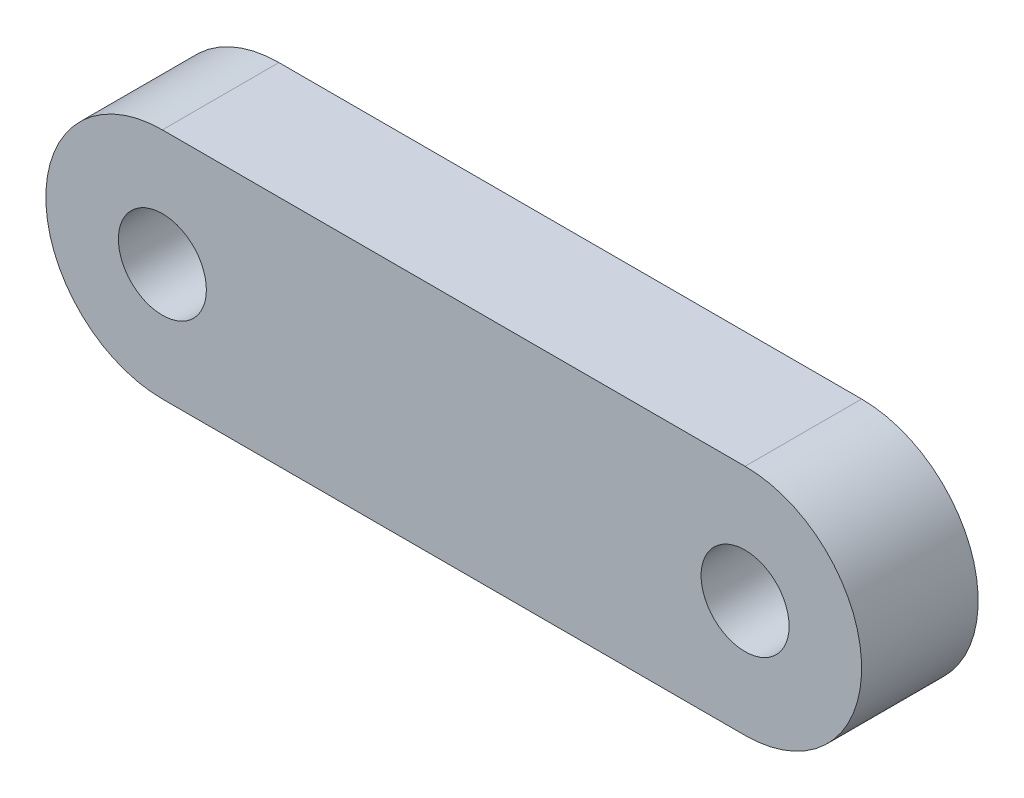
ISO-10303-21;
HEADER;
FILE_DESCRIPTION(('STEP AP214'),'2;1');
FILE_NAME('part.step','',(''),(''),'','','');
FILE_SCHEMA(('AUTOMOTIVE_DESIGN { 1 0 10303 214 1 1 1 1 }'));
ENDSEC;
DATA;
#1=APPLICATION_CONTEXT('core data for automotive mechanical design processes');
#2=APPLICATION_PROTOCOL_DEFINITION('international standard','automotive_design',2000,#1);
#3=PRODUCT_CONTEXT('',#1,'mechanical');
#4=PRODUCT('Part','Part','',(#3));
#5=PRODUCT_RELATED_PRODUCT_CATEGORY('part','',(#4));
#6=PRODUCT_DEFINITION_FORMATION('','',#4);
#7=PRODUCT_DEFINITION_CONTEXT('part definition',#1,'design');
#8=PRODUCT_DEFINITION('design','',#6,#7);
#9=PRODUCT_DEFINITION_SHAPE('','',#8);
#10=(LENGTH_UNIT() NAMED_UNIT(*) SI_UNIT(.MILLI.,.METRE.));
#11=(NAMED_UNIT(*) PLANE_ANGLE_UNIT() SI_UNIT($,.RADIAN.));
#12=(NAMED_UNIT(*) SI_UNIT($,.STERADIAN.) SOLID_ANGLE_UNIT());
#13=UNCERTAINTY_MEASURE_WITH_UNIT(LENGTH_MEASURE(1.E-05),#10,'distance_accuracy_value','');
#14=(GEOMETRIC_REPRESENTATION_CONTEXT(3) GLOBAL_UNCERTAINTY_ASSIGNED_CONTEXT((#13)) GLOBAL_UNIT_ASSIGNED_CONTEXT((#10,
#11,#12)) REPRESENTATION_CONTEXT('',''));
#15=CARTESIAN_POINT('',(0.,0.,0.));
#16=DIRECTION('',(0.,0.,1.));
#17=DIRECTION('',(1.,0.,0.));
#18=AXIS2_PLACEMENT_3D('',#15,#16,#17);
#19=CARTESIAN_POINT('',(0.,0.,4.));
#20=DIRECTION('',(0.,0.,1.));
#21=DIRECTION('',(1.,0.,0.));
#22=AXIS2_PLACEMENT_3D('',#19,#20,#21);
#23=PLANE('',#22);
#24=CARTESIAN_POINT('',(0.,0.,4.));
#25=DIRECTION('',(0.,0.,1.));
#26=DIRECTION('',(1.,0.,0.));
#27=AXIS2_PLACEMENT_3D('',#24,#25,#26);
#28=CIRCLE('',#27,1.51);
#29=CARTESIAN_POINT('',(1.51,0.,4.));
#30=VERTEX_POINT('',#29);
#31=EDGE_CURVE('E110',#30,#30,#28,.T.);
#32=ORIENTED_EDGE('',*,*,#31,.F.);
#33=EDGE_LOOP('',(#32));
#34=FACE_BOUND('',#33,.T.);
#35=CARTESIAN_POINT('',(0.,0.,4.));
#36=DIRECTION('',(0.,0.,1.));
#37=DIRECTION('',(1.,0.,0.));
#38=AXIS2_PLACEMENT_3D('',#35,#36,#37);
#39=CIRCLE('',#38,4.);
#40=CARTESIAN_POINT('',(0.,4.,4.));
#41=VERTEX_POINT('',#40);
#42=CARTESIAN_POINT('',(0.,-4.,4.));
#43=VERTEX_POINT('',#42);
#44=EDGE_CURVE('E95',#41,#43,#39,.T.);
#45=ORIENTED_EDGE('',*,*,#44,.T.);
#46=DIRECTION('',(1.,0.,0.));
#47=VECTOR('',#46,1.);
#48=CARTESIAN_POINT('',(0.,-4.,4.));
#49=LINE('',#48,#47);
#50=CARTESIAN_POINT('',(20.,-4.,4.));
#51=VERTEX_POINT('',#50);
#52=EDGE_CURVE('E90',#43,#51,#49,.T.);
#53=ORIENTED_EDGE('',*,*,#52,.T.);
#54=CARTESIAN_POINT('',(20.,0.,4.));
#55=DIRECTION('',(0.,0.,1.));
#56=DIRECTION('',(1.,0.,0.));
#57=AXIS2_PLACEMENT_3D('',#54,#55,#56);
#58=CIRCLE('',#57,4.);
#59=CARTESIAN_POINT('',(20.,4.,4.));
#60=VERTEX_POINT('',#59);
#61=EDGE_CURVE('E93',#51,#60,#58,.T.);
#62=ORIENTED_EDGE('',*,*,#61,.T.);
#63=DIRECTION('',(-1.,0.,0.));
#64=VECTOR('',#63,1.);
#65=CARTESIAN_POINT('',(0.,4.,4.));
#66=LINE('',#65,#64);
#67=EDGE_CURVE('E60',#60,#41,#66,.T.);
#68=ORIENTED_EDGE('',*,*,#67,.T.);
#69=EDGE_LOOP('',(#45,#53,#62,#68));
#70=FACE_BOUND('',#69,.T.);
#71=CARTESIAN_POINT('',(20.,0.,4.));
#72=DIRECTION('',(0.,0.,1.));
#73=DIRECTION('',(1.,0.,0.));
#74=AXIS2_PLACEMENT_3D('',#71,#72,#73);
#75=CIRCLE('',#74,1.51);
#76=CARTESIAN_POINT('',(21.51,0.,4.));
#77=VERTEX_POINT('',#76);
#78=EDGE_CURVE('E125',#77,#77,#75,.T.);
#79=ORIENTED_EDGE('',*,*,#78,.F.);
#80=EDGE_LOOP('',(#79));
#81=FACE_BOUND('',#80,.T.);
#82=ADVANCED_FACE('F43',(#34,#70,#81),#23,.T.);
#83=CARTESIAN_POINT('',(0.,0.,0.));
#84=DIRECTION('',(0.,0.,1.));
#85=DIRECTION('',(1.,0.,0.));
#86=AXIS2_PLACEMENT_3D('',#83,#84,#85);
#87=PLANE('',#86);
#88=CARTESIAN_POINT('',(0.,0.,0.));
#89=DIRECTION('',(0.,0.,1.));
#90=DIRECTION('',(1.,0.,0.));
#91=AXIS2_PLACEMENT_3D('',#88,#89,#90);
#92=CIRCLE('',#91,4.);
#93=CARTESIAN_POINT('',(0.,4.,0.));
#94=VERTEX_POINT('',#93);
#95=CARTESIAN_POINT('',(0.,-4.,0.));
#96=VERTEX_POINT('',#95);
#97=EDGE_CURVE('E107',#94,#96,#92,.T.);
#98=ORIENTED_EDGE('',*,*,#97,.F.);
#99=DIRECTION('',(-1.,0.,0.));
#100=VECTOR('',#99,1.);
#101=CARTESIAN_POINT('',(0.,4.,0.));
#102=LINE('',#101,#100);
#103=CARTESIAN_POINT('',(20.,4.,0.));
#104=VERTEX_POINT('',#103);
#105=EDGE_CURVE('E83',#104,#94,#102,.T.);
#106=ORIENTED_EDGE('',*,*,#105,.F.);
#107=CARTESIAN_POINT('',(20.,0.,0.));
#108=DIRECTION('',(0.,0.,1.));
#109=DIRECTION('',(1.,0.,0.));
#110=AXIS2_PLACEMENT_3D('',#107,#108,#109);
#111=CIRCLE('',#110,4.);
#112=CARTESIAN_POINT('',(20.,-4.,0.));
#113=VERTEX_POINT('',#112);
#114=EDGE_CURVE('E77',#113,#104,#111,.T.);
#115=ORIENTED_EDGE('',*,*,#114,.F.);
#116=DIRECTION('',(1.,0.,0.));
#117=VECTOR('',#116,1.);
#118=CARTESIAN_POINT('',(0.,-4.,0.));
#119=LINE('',#118,#117);
#120=EDGE_CURVE('E99',#96,#113,#119,.T.);
#121=ORIENTED_EDGE('',*,*,#120,.F.);
#122=EDGE_LOOP('',(#98,#106,#115,#121));
#123=FACE_BOUND('',#122,.T.);
#124=CARTESIAN_POINT('',(0.,0.,0.));
#125=DIRECTION('',(0.,0.,1.));
#126=DIRECTION('',(1.,0.,0.));
#127=AXIS2_PLACEMENT_3D('',#124,#125,#126);
#128=CIRCLE('',#127,1.51);
#129=CARTESIAN_POINT('',(1.51,0.,0.));
#130=VERTEX_POINT('',#129);
#131=EDGE_CURVE('E122',#130,#130,#128,.T.);
#132=ORIENTED_EDGE('',*,*,#131,.T.);
#133=EDGE_LOOP('',(#132));
#134=FACE_BOUND('',#133,.T.);
#135=CARTESIAN_POINT('',(20.,0.,0.));
#136=DIRECTION('',(0.,0.,1.));
#137=DIRECTION('',(1.,0.,0.));
#138=AXIS2_PLACEMENT_3D('',#135,#136,#137);
#139=CIRCLE('',#138,1.51);
#140=CARTESIAN_POINT('',(21.51,0.,0.));
#141=VERTEX_POINT('',#140);
#142=EDGE_CURVE('E128',#141,#141,#139,.T.);
#143=ORIENTED_EDGE('',*,*,#142,.T.);
#144=EDGE_LOOP('',(#143));
#145=FACE_BOUND('',#144,.T.);
#146=ADVANCED_FACE('F118',(#123,#134,#145),#87,.F.);
#147=CARTESIAN_POINT('',(0.,0.,4.));
#148=DIRECTION('',(0.,0.,-1.));
#149=DIRECTION('',(-1.,0.,0.));
#150=AXIS2_PLACEMENT_3D('',#147,#148,#149);
#151=CYLINDRICAL_SURFACE('',#150,4.);
#152=ORIENTED_EDGE('',*,*,#97,.T.);
#153=DIRECTION('',(0.,0.,-1.));
#154=VECTOR('',#153,1.);
#155=CARTESIAN_POINT('',(0.,-4.,4.));
#156=LINE('',#155,#154);
#157=EDGE_CURVE('E11',#43,#96,#156,.T.);
#158=ORIENTED_EDGE('',*,*,#157,.F.);
#159=ORIENTED_EDGE('',*,*,#44,.F.);
#160=DIRECTION('',(0.,0.,-1.));
#161=VECTOR('',#160,1.);
#162=CARTESIAN_POINT('',(0.,4.,4.));
#163=LINE('',#162,#161);
#164=EDGE_CURVE('E103',#41,#94,#163,.T.);
#165=ORIENTED_EDGE('',*,*,#164,.T.);
#166=EDGE_LOOP('',(#152,#158,#159,#165));
#167=FACE_BOUND('',#166,.T.);
#168=ADVANCED_FACE('F45',(#167),#151,.T.);
#169=CARTESIAN_POINT('',(0.,-4.,4.));
#170=DIRECTION('',(0.,1.,0.));
#171=DIRECTION('',(-1.,0.,0.));
#172=AXIS2_PLACEMENT_3D('',#169,#170,#171);
#173=PLANE('',#172);
#174=ORIENTED_EDGE('',*,*,#120,.T.);
#175=DIRECTION('',(0.,0.,-1.));
#176=VECTOR('',#175,1.);
#177=CARTESIAN_POINT('',(20.,-4.,4.));
#178=LINE('',#177,#176);
#179=EDGE_CURVE('E52',#51,#113,#178,.T.);
#180=ORIENTED_EDGE('',*,*,#179,.F.);
#181=ORIENTED_EDGE('',*,*,#52,.F.);
#182=ORIENTED_EDGE('',*,*,#157,.T.);
#183=EDGE_LOOP('',(#174,#180,#181,#182));
#184=FACE_BOUND('',#183,.T.);
#185=ADVANCED_FACE('F98',(#184),#173,.F.);
#186=CARTESIAN_POINT('',(20.,0.,4.));
#187=DIRECTION('',(0.,0.,-1.));
#188=DIRECTION('',(-1.,0.,0.));
#189=AXIS2_PLACEMENT_3D('',#186,#187,#188);
#190=CYLINDRICAL_SURFACE('',#189,4.);
#191=ORIENTED_EDGE('',*,*,#114,.T.);
#192=DIRECTION('',(0.,0.,-1.));
#193=VECTOR('',#192,1.);
#194=CARTESIAN_POINT('',(20.,4.,4.));
#195=LINE('',#194,#193);
#196=EDGE_CURVE('E100',#60,#104,#195,.T.);
#197=ORIENTED_EDGE('',*,*,#196,.F.);
#198=ORIENTED_EDGE('',*,*,#61,.F.);
#199=ORIENTED_EDGE('',*,*,#179,.T.);
#200=EDGE_LOOP('',(#191,#197,#198,#199));
#201=FACE_BOUND('',#200,.T.);
#202=ADVANCED_FACE('F101',(#201),#190,.T.);
#203=CARTESIAN_POINT('',(0.,4.,4.));
#204=DIRECTION('',(0.,-1.,0.));
#205=DIRECTION('',(1.,0.,0.));
#206=AXIS2_PLACEMENT_3D('',#203,#204,#205);
#207=PLANE('',#206);
#208=ORIENTED_EDGE('',*,*,#105,.T.);
#209=ORIENTED_EDGE('',*,*,#164,.F.);
#210=ORIENTED_EDGE('',*,*,#67,.F.);
#211=ORIENTED_EDGE('',*,*,#196,.T.);
#212=EDGE_LOOP('',(#208,#209,#210,#211));
#213=FACE_BOUND('',#212,.T.);
#214=ADVANCED_FACE('F115',(#213),#207,.F.);
#215=CARTESIAN_POINT('',(0.,0.,4.));
#216=DIRECTION('',(0.,0.,-1.));
#217=DIRECTION('',(-1.,0.,0.));
#218=AXIS2_PLACEMENT_3D('',#215,#216,#217);
#219=CYLINDRICAL_SURFACE('',#218,1.51);
#220=ORIENTED_EDGE('',*,*,#31,.T.);
#221=EDGE_LOOP('',(#220));
#222=FACE_BOUND('',#221,.T.);
#223=ORIENTED_EDGE('',*,*,#131,.F.);
#224=EDGE_LOOP('',(#223));
#225=FACE_BOUND('',#224,.T.);
#226=ADVANCED_FACE('F145',(#222,#225),#219,.F.);
#227=CARTESIAN_POINT('',(20.,0.,4.));
#228=DIRECTION('',(0.,0.,-1.));
#229=DIRECTION('',(-1.,0.,0.));
#230=AXIS2_PLACEMENT_3D('',#227,#228,#229);
#231=CYLINDRICAL_SURFACE('',#230,1.51);
#232=ORIENTED_EDGE('',*,*,#78,.T.);
#233=EDGE_LOOP('',(#232));
#234=FACE_BOUND('',#233,.T.);
#235=ORIENTED_EDGE('',*,*,#142,.F.);
#236=EDGE_LOOP('',(#235));
#237=FACE_BOUND('',#236,.T.);
#238=ADVANCED_FACE('F134',(#234,#237),#231,.F.);
#239=CLOSED_SHELL('',(#82,#146,#168,#185,#202,#214,#226,#238));
#240=MANIFOLD_SOLID_BREP('B2',#239);
#241=ADVANCED_BREP_SHAPE_REPRESENTATION('',(#18,#240),#14);
#242=SHAPE_DEFINITION_REPRESENTATION(#9,#241);
ENDSEC;
END-ISO-10303-21;
